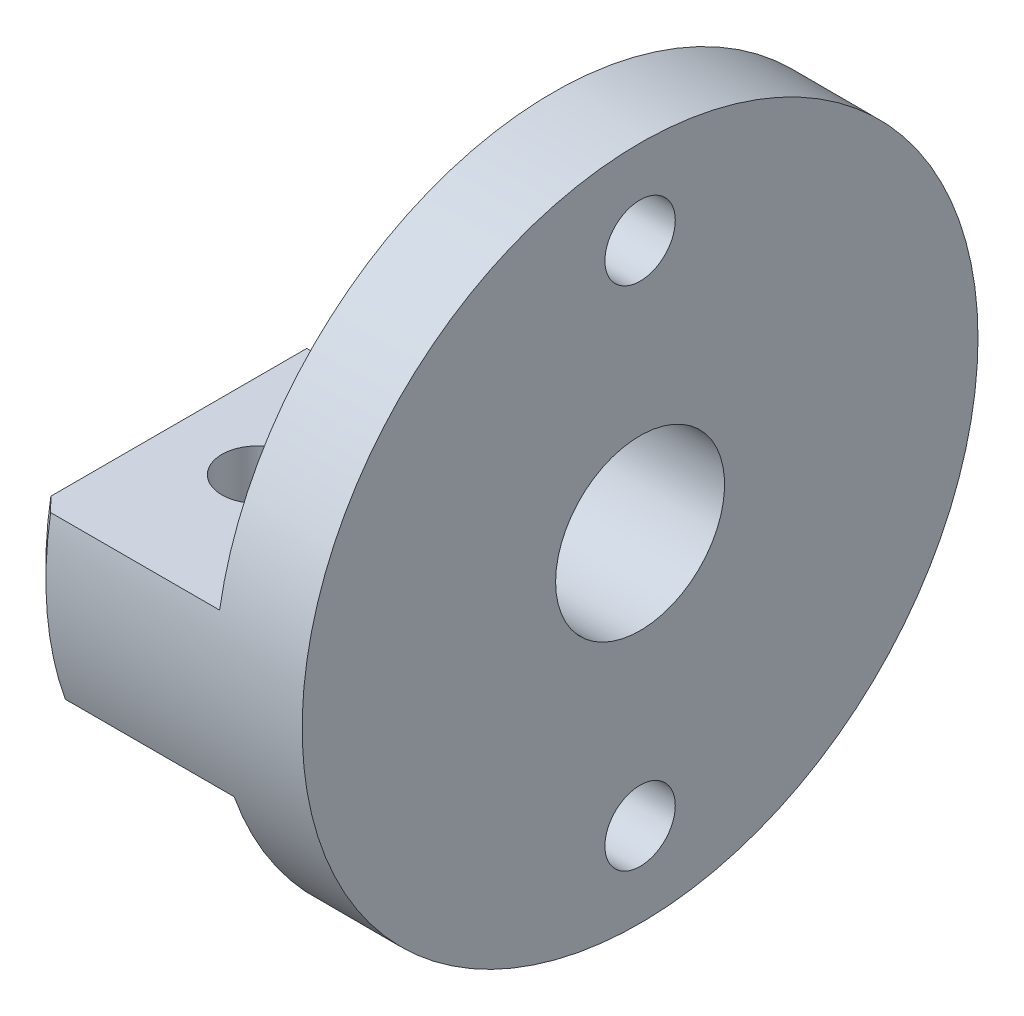
ISO-10303-21;
HEADER;
FILE_DESCRIPTION(('STEP AP214'),'2;1');
FILE_NAME('part.step','',(''),(''),'','','');
FILE_SCHEMA(('AUTOMOTIVE_DESIGN { 1 0 10303 214 1 1 1 1 }'));
ENDSEC;
DATA;
#1=APPLICATION_CONTEXT('core data for automotive mechanical design processes');
#2=APPLICATION_PROTOCOL_DEFINITION('international standard','automotive_design',2000,#1);
#3=PRODUCT_CONTEXT('',#1,'mechanical');
#4=PRODUCT('Part','Part','',(#3));
#5=PRODUCT_RELATED_PRODUCT_CATEGORY('part','',(#4));
#6=PRODUCT_DEFINITION_FORMATION('','',#4);
#7=PRODUCT_DEFINITION_CONTEXT('part definition',#1,'design');
#8=PRODUCT_DEFINITION('design','',#6,#7);
#9=PRODUCT_DEFINITION_SHAPE('','',#8);
#10=(LENGTH_UNIT() NAMED_UNIT(*) SI_UNIT(.MILLI.,.METRE.));
#11=(NAMED_UNIT(*) PLANE_ANGLE_UNIT() SI_UNIT($,.RADIAN.));
#12=(NAMED_UNIT(*) SI_UNIT($,.STERADIAN.) SOLID_ANGLE_UNIT());
#13=UNCERTAINTY_MEASURE_WITH_UNIT(LENGTH_MEASURE(1.E-05),#10,'distance_accuracy_value','');
#14=(GEOMETRIC_REPRESENTATION_CONTEXT(3) GLOBAL_UNCERTAINTY_ASSIGNED_CONTEXT((#13)) GLOBAL_UNIT_ASSIGNED_CONTEXT((#10,
#11,#12)) REPRESENTATION_CONTEXT('',''));
#15=CARTESIAN_POINT('',(0.,0.,0.));
#16=DIRECTION('',(0.,0.,1.));
#17=DIRECTION('',(1.,0.,0.));
#18=AXIS2_PLACEMENT_3D('',#15,#16,#17);
#19=CARTESIAN_POINT('',(6.,0.,0.));
#20=DIRECTION('',(-1.,0.,0.));
#21=DIRECTION('',(0.,0.,1.));
#22=AXIS2_PLACEMENT_3D('',#19,#20,#21);
#23=CYLINDRICAL_SURFACE('',#22,12.);
#24=CARTESIAN_POINT('',(6.5,0.,0.));
#25=DIRECTION('',(-1.,0.,0.));
#26=DIRECTION('',(0.,0.,1.));
#27=AXIS2_PLACEMENT_3D('',#24,#25,#26);
#28=CIRCLE('',#27,12.);
#29=CARTESIAN_POINT('',(6.5,-4.,-11.3137084989848));
#30=VERTEX_POINT('',#29);
#31=CARTESIAN_POINT('',(6.5,-4.,11.3137084989848));
#32=VERTEX_POINT('',#31);
#33=EDGE_CURVE('E121',#30,#32,#28,.T.);
#34=ORIENTED_EDGE('',*,*,#33,.F.);
#35=DIRECTION('',(-1.,0.,0.));
#36=VECTOR('',#35,1.);
#37=CARTESIAN_POINT('',(6.,-4.,-11.3137084989848));
#38=LINE('',#37,#36);
#39=CARTESIAN_POINT('',(0.499999999999997,-4.,-11.3137084989848));
#40=VERTEX_POINT('',#39);
#41=EDGE_CURVE('E126',#30,#40,#38,.T.);
#42=ORIENTED_EDGE('',*,*,#41,.T.);
#43=CARTESIAN_POINT('',(0.499999999999997,0.,0.));
#44=DIRECTION('',(1.,0.,0.));
#45=DIRECTION('',(0.,0.,-1.));
#46=AXIS2_PLACEMENT_3D('',#43,#44,#45);
#47=CIRCLE('',#46,12.);
#48=CARTESIAN_POINT('',(0.499999999999997,2.,-11.8321595661992));
#49=VERTEX_POINT('',#48);
#50=EDGE_CURVE('E188',#40,#49,#47,.T.);
#51=ORIENTED_EDGE('',*,*,#50,.T.);
#52=DIRECTION('',(-1.,0.,0.));
#53=VECTOR('',#52,1.);
#54=CARTESIAN_POINT('',(6.,2.,-11.8321595661992));
#55=LINE('',#54,#53);
#56=CARTESIAN_POINT('',(6.5,2.,-11.8321595661992));
#57=VERTEX_POINT('',#56);
#58=EDGE_CURVE('E165',#57,#49,#55,.T.);
#59=ORIENTED_EDGE('',*,*,#58,.F.);
#60=CARTESIAN_POINT('',(6.5,0.,0.));
#61=DIRECTION('',(-1.,0.,0.));
#62=DIRECTION('',(0.,0.,1.));
#63=AXIS2_PLACEMENT_3D('',#60,#61,#62);
#64=CIRCLE('',#63,12.);
#65=CARTESIAN_POINT('',(6.5,2.,11.8321595661992));
#66=VERTEX_POINT('',#65);
#67=EDGE_CURVE('E150',#66,#57,#64,.T.);
#68=ORIENTED_EDGE('',*,*,#67,.F.);
#69=DIRECTION('',(-1.,0.,0.));
#70=VECTOR('',#69,1.);
#71=CARTESIAN_POINT('',(6.,2.,11.8321595661992));
#72=LINE('',#71,#70);
#73=CARTESIAN_POINT('',(0.500000000000007,2.,11.8321595661992));
#74=VERTEX_POINT('',#73);
#75=EDGE_CURVE('E167',#66,#74,#72,.T.);
#76=ORIENTED_EDGE('',*,*,#75,.T.);
#77=CARTESIAN_POINT('',(0.500000000000007,0.,0.));
#78=DIRECTION('',(1.,0.,0.));
#79=DIRECTION('',(0.,0.,-1.));
#80=AXIS2_PLACEMENT_3D('',#77,#78,#79);
#81=CIRCLE('',#80,12.);
#82=CARTESIAN_POINT('',(0.500000000000007,-4.,11.3137084989848));
#83=VERTEX_POINT('',#82);
#84=EDGE_CURVE('E124',#74,#83,#81,.T.);
#85=ORIENTED_EDGE('',*,*,#84,.T.);
#86=DIRECTION('',(-1.,0.,0.));
#87=VECTOR('',#86,1.);
#88=CARTESIAN_POINT('',(6.,-4.,11.3137084989848));
#89=LINE('',#88,#87);
#90=EDGE_CURVE('E117',#32,#83,#89,.T.);
#91=ORIENTED_EDGE('',*,*,#90,.F.);
#92=EDGE_LOOP('',(#34,#42,#51,#59,#68,#76,#85,#91));
#93=FACE_BOUND('',#92,.T.);
#94=CARTESIAN_POINT('',(9.6,0.,0.));
#95=DIRECTION('',(1.,0.,0.));
#96=DIRECTION('',(0.,0.,-1.));
#97=AXIS2_PLACEMENT_3D('',#94,#95,#96);
#98=CIRCLE('',#97,12.);
#99=CARTESIAN_POINT('',(9.6,0.,-12.));
#100=VERTEX_POINT('',#99);
#101=EDGE_CURVE('E177',#100,#100,#98,.T.);
#102=ORIENTED_EDGE('',*,*,#101,.F.);
#103=EDGE_LOOP('',(#102));
#104=FACE_BOUND('',#103,.T.);
#105=ADVANCED_FACE('F49',(#93,#104),#23,.T.);
#106=CARTESIAN_POINT('',(0.,0.,0.));
#107=DIRECTION('',(1.,0.,0.));
#108=DIRECTION('',(0.,0.,-1.));
#109=AXIS2_PLACEMENT_3D('',#106,#107,#108);
#110=PLANE('',#109);
#111=DIRECTION('',(0.,0.,1.));
#112=VECTOR('',#111,1.);
#113=CARTESIAN_POINT('',(0.,2.,-11.8321595661992));
#114=LINE('',#113,#112);
#115=CARTESIAN_POINT('',(0.,2.,-11.3247516529061));
#116=VERTEX_POINT('',#115);
#117=CARTESIAN_POINT('',(0.,2.,-2.23606797749979));
#118=VERTEX_POINT('',#117);
#119=EDGE_CURVE('E163',#116,#118,#114,.T.);
#120=ORIENTED_EDGE('',*,*,#119,.F.);
#121=CARTESIAN_POINT('',(0.,0.,0.));
#122=DIRECTION('',(1.,0.,0.));
#123=DIRECTION('',(0.,0.,-1.));
#124=AXIS2_PLACEMENT_3D('',#121,#122,#123);
#125=CIRCLE('',#124,11.5);
#126=CARTESIAN_POINT('',(0.,-4.,-10.7819293264239));
#127=VERTEX_POINT('',#126);
#128=EDGE_CURVE('E67',#116,#127,#125,.F.);
#129=ORIENTED_EDGE('',*,*,#128,.T.);
#130=DIRECTION('',(0.,0.,-1.));
#131=VECTOR('',#130,1.);
#132=CARTESIAN_POINT('',(0.,-4.,11.3137084989848));
#133=LINE('',#132,#131);
#134=CARTESIAN_POINT('',(0.,-4.,10.7819293264239));
#135=VERTEX_POINT('',#134);
#136=EDGE_CURVE('E127',#135,#127,#133,.T.);
#137=ORIENTED_EDGE('',*,*,#136,.F.);
#138=CARTESIAN_POINT('',(0.,0.,0.));
#139=DIRECTION('',(1.,0.,0.));
#140=DIRECTION('',(0.,0.,-1.));
#141=AXIS2_PLACEMENT_3D('',#138,#139,#140);
#142=CIRCLE('',#141,11.5);
#143=CARTESIAN_POINT('',(0.,2.,11.3247516529061));
#144=VERTEX_POINT('',#143);
#145=EDGE_CURVE('E198',#135,#144,#142,.F.);
#146=ORIENTED_EDGE('',*,*,#145,.T.);
#147=CARTESIAN_POINT('',(0.,2.,2.23606797749979));
#148=VERTEX_POINT('',#147);
#149=EDGE_CURVE('E166',#148,#144,#114,.T.);
#150=ORIENTED_EDGE('',*,*,#149,.F.);
#151=CARTESIAN_POINT('',(0.,0.,0.));
#152=DIRECTION('',(-1.,0.,0.));
#153=DIRECTION('',(0.,0.,1.));
#154=AXIS2_PLACEMENT_3D('',#151,#152,#153);
#155=CIRCLE('',#154,3.);
#156=EDGE_CURVE('E169',#118,#148,#155,.T.);
#157=ORIENTED_EDGE('',*,*,#156,.F.);
#158=EDGE_LOOP('',(#120,#129,#137,#146,#150,#157));
#159=FACE_BOUND('',#158,.T.);
#160=ADVANCED_FACE('F273',(#159),#110,.F.);
#161=CARTESIAN_POINT('',(9.6,0.,0.));
#162=DIRECTION('',(1.,0.,0.));
#163=DIRECTION('',(0.,0.,-1.));
#164=AXIS2_PLACEMENT_3D('',#161,#162,#163);
#165=PLANE('',#164);
#166=CARTESIAN_POINT('',(9.6,9.,0.));
#167=DIRECTION('',(1.,0.,0.));
#168=DIRECTION('',(0.,0.,-1.));
#169=AXIS2_PLACEMENT_3D('',#166,#167,#168);
#170=CIRCLE('',#169,1.25);
#171=CARTESIAN_POINT('',(9.6,9.,-1.25));
#172=VERTEX_POINT('',#171);
#173=EDGE_CURVE('E228',#172,#172,#170,.T.);
#174=ORIENTED_EDGE('',*,*,#173,.F.);
#175=EDGE_LOOP('',(#174));
#176=FACE_BOUND('',#175,.T.);
#177=CARTESIAN_POINT('',(9.6,-9.,0.));
#178=DIRECTION('',(1.,0.,0.));
#179=DIRECTION('',(0.,0.,-1.));
#180=AXIS2_PLACEMENT_3D('',#177,#178,#179);
#181=CIRCLE('',#180,1.25);
#182=CARTESIAN_POINT('',(9.6,-9.,-1.25));
#183=VERTEX_POINT('',#182);
#184=EDGE_CURVE('E234',#183,#183,#181,.T.);
#185=ORIENTED_EDGE('',*,*,#184,.F.);
#186=EDGE_LOOP('',(#185));
#187=FACE_BOUND('',#186,.T.);
#188=CARTESIAN_POINT('',(9.6,0.,0.));
#189=DIRECTION('',(-1.,0.,0.));
#190=DIRECTION('',(0.,0.,1.));
#191=AXIS2_PLACEMENT_3D('',#188,#189,#190);
#192=CIRCLE('',#191,3.);
#193=CARTESIAN_POINT('',(9.6,0.,3.));
#194=VERTEX_POINT('',#193);
#195=EDGE_CURVE('E174',#194,#194,#192,.T.);
#196=ORIENTED_EDGE('',*,*,#195,.T.);
#197=EDGE_LOOP('',(#196));
#198=FACE_BOUND('',#197,.T.);
#199=ORIENTED_EDGE('',*,*,#101,.T.);
#200=EDGE_LOOP('',(#199));
#201=FACE_BOUND('',#200,.T.);
#202=ADVANCED_FACE('F278',(#176,#187,#198,#201),#165,.T.);
#203=CARTESIAN_POINT('',(9.6,0.,0.));
#204=DIRECTION('',(-1.,0.,0.));
#205=DIRECTION('',(0.,0.,1.));
#206=AXIS2_PLACEMENT_3D('',#203,#204,#205);
#207=CYLINDRICAL_SURFACE('',#206,3.);
#208=CARTESIAN_POINT('',(2.6,-2.72717802865893,-1.25));
#209=CARTESIAN_POINT('',(2.66667189089685,-2.72718519563219,-1.24999259066568));
#210=CARTESIAN_POINT('',(2.73345265682622,-2.729658595344,-1.24463203881503));
#211=CARTESIAN_POINT('',(2.86508694205714,-2.73923833650884,-1.22339678947785));
#212=CARTESIAN_POINT('',(2.92993472667524,-2.74635725824267,-1.20749354003276));
#213=CARTESIAN_POINT('',(3.05556112969107,-2.76426917574768,-1.16589988419451));
#214=CARTESIAN_POINT('',(3.11635516371502,-2.77504717562616,-1.14024937431428));
#215=CARTESIAN_POINT('',(3.23275944957805,-2.79904148565793,-1.08000637754463));
#216=CARTESIAN_POINT('',(3.28837092343312,-2.81225721880783,-1.04541600591531));
#217=CARTESIAN_POINT('',(3.39632572497347,-2.84055762619857,-0.965973882676167));
#218=CARTESIAN_POINT('',(3.44830755874409,-2.85570568079146,-0.920653238184409));
#219=CARTESIAN_POINT('',(3.54420022249756,-2.88564295372227,-0.82202167574555));
#220=CARTESIAN_POINT('',(3.58810794061301,-2.90043203180789,-0.768707691374005));
#221=CARTESIAN_POINT('',(3.66844953087928,-2.92875537930613,-0.652763393797348));
#222=CARTESIAN_POINT('',(3.70447662803235,-2.94220739975291,-0.589829293683659));
#223=CARTESIAN_POINT('',(3.76527602050561,-2.96556519993426,-0.458132022362353));
#224=CARTESIAN_POINT('',(3.79005331196422,-2.97547255347157,-0.389371454872124));
#225=CARTESIAN_POINT('',(3.82633945875674,-2.99017521042367,-0.251768498025165));
#226=CARTESIAN_POINT('',(3.83847169490205,-2.99520971127466,-0.18311657619608));
#227=CARTESIAN_POINT('',(3.85113764115986,-3.00046828611204,-0.044579180365006));
#228=CARTESIAN_POINT('',(3.85167605588296,-3.00069431131015,0.0253057817645165));
#229=CARTESIAN_POINT('',(3.84146571906668,-2.99645129133057,0.159792780112568));
#230=CARTESIAN_POINT('',(3.83140189947427,-2.99226714648664,0.224457488607314));
#231=CARTESIAN_POINT('',(3.80144689736184,-2.98006516750309,0.351082893931456));
#232=CARTESIAN_POINT('',(3.78155499036984,-2.97204705074577,0.413043391054916));
#233=CARTESIAN_POINT('',(3.73227195910536,-2.95279852414029,0.533638118077526));
#234=CARTESIAN_POINT('',(3.70274053712918,-2.94152097126085,0.592207177074906));
#235=CARTESIAN_POINT('',(3.63515424329966,-2.91685713989805,0.703711767281963));
#236=CARTESIAN_POINT('',(3.59709635915501,-2.90347011666255,0.756645297756975));
#237=CARTESIAN_POINT('',(3.51041757959538,-2.87481698777061,0.859340911707924));
#238=CARTESIAN_POINT('',(3.46124120872099,-2.8594849435601,0.908616437316241));
#239=CARTESIAN_POINT('',(3.35528855929342,-2.8293786068147,0.998431414927668));
#240=CARTESIAN_POINT('',(3.29850936170791,-2.8146045313137,1.03896749582431));
#241=CARTESIAN_POINT('',(3.17660496333809,-2.78681612355338,1.11140189250063));
#242=CARTESIAN_POINT('',(3.11126679425672,-2.77387558556714,1.1429725335554));
#243=CARTESIAN_POINT('',(2.9755189550255,-2.75209844221011,1.19446432058392));
#244=CARTESIAN_POINT('',(2.90511295173045,-2.74325890334594,1.21439379627313));
#245=CARTESIAN_POINT('',(2.766103191086,-2.73141212519724,1.24080025168121));
#246=CARTESIAN_POINT('',(2.69767887774095,-2.72806369197117,1.24806614632866));
#247=CARTESIAN_POINT('',(2.5605215175885,-2.72660286810642,1.25125630518999));
#248=CARTESIAN_POINT('',(2.49178858580829,-2.72848866599319,1.24718449318149));
#249=CARTESIAN_POINT('',(2.36060161456955,-2.73693131345749,1.22853477565556));
#250=CARTESIAN_POINT('',(2.2980273132132,-2.74318138016618,1.21464618818048));
#251=CARTESIAN_POINT('',(2.17614870350213,-2.75925630297447,1.17767058564225));
#252=CARTESIAN_POINT('',(2.11684516316929,-2.76908199460161,1.15458142053125));
#253=CARTESIAN_POINT('',(2.00038468964353,-2.79170797857,1.09877520805187));
#254=CARTESIAN_POINT('',(1.94342502538968,-2.80461662202282,1.06569183306198));
#255=CARTESIAN_POINT('',(1.83559194750098,-2.83180003740794,0.991200784385971));
#256=CARTESIAN_POINT('',(1.78472118329813,-2.84607539920583,0.949789507875988));
#257=CARTESIAN_POINT('',(1.68619986511599,-2.87578619784532,0.855844455715506));
#258=CARTESIAN_POINT('',(1.63914860004934,-2.89122146708842,0.802679661479739));
#259=CARTESIAN_POINT('',(1.55452770802067,-2.92043361183923,0.68885151255354));
#260=CARTESIAN_POINT('',(1.5169587759363,-2.93421036577013,0.628187608803657));
#261=CARTESIAN_POINT('',(1.45241012455642,-2.9586425158565,0.500654680803385));
#262=CARTESIAN_POINT('',(1.42545775871052,-2.96928983138826,0.433770169638507));
#263=CARTESIAN_POINT('',(1.38338320766557,-2.98618173103366,0.295858835154417));
#264=CARTESIAN_POINT('',(1.36825398177393,-2.9924289351992,0.224834504225196));
#265=CARTESIAN_POINT('',(1.35114187447969,-2.9995153479751,0.0860165335064118));
#266=CARTESIAN_POINT('',(1.34831400030304,-3.00070204534225,0.0183440847938984));
#267=CARTESIAN_POINT('',(1.35361314129394,-2.99849523480953,-0.116486811714285));
#268=CARTESIAN_POINT('',(1.36173823601287,-2.99510252984313,-0.183645347541155));
#269=CARTESIAN_POINT('',(1.38810607215866,-2.98430065981734,-0.313086482449184));
#270=CARTESIAN_POINT('',(1.40597968046955,-2.97703824209233,-0.375457537843568));
#271=CARTESIAN_POINT('',(1.45093424720913,-2.95929499847058,-0.49629223050133));
#272=CARTESIAN_POINT('',(1.4780169546649,-2.94881356124207,-0.554755122985826));
#273=CARTESIAN_POINT('',(1.54198952921446,-2.92505825398662,-0.669024565478781));
#274=CARTESIAN_POINT('',(1.57926730142399,-2.91167959188766,-0.724591657976682));
#275=CARTESIAN_POINT('',(1.66200718287189,-2.88371561874231,-0.828918675638781));
#276=CARTESIAN_POINT('',(1.70747233040675,-2.86912986083797,-0.877676061786042));
#277=CARTESIAN_POINT('',(1.8089448258544,-2.83914845259141,-0.97044978723158));
#278=CARTESIAN_POINT('',(1.86545901462112,-2.82376522857896,-1.01391775364847));
#279=CARTESIAN_POINT('',(1.98545874068019,-2.79495552690186,-1.09083332306674));
#280=CARTESIAN_POINT('',(2.04894814805814,-2.78153014522558,-1.12427532456755));
#281=CARTESIAN_POINT('',(2.18094383502275,-2.75842557732642,-1.17982766043577));
#282=CARTESIAN_POINT('',(2.24942115879321,-2.74872654469865,-1.20199823632854));
#283=CARTESIAN_POINT('',(2.38953957385067,-2.73440803066667,-1.23423556453801));
#284=CARTESIAN_POINT('',(2.4611692072743,-2.72977151604981,-1.2443429152121));
#285=CARTESIAN_POINT('',(2.55535852426189,-2.72744979732688,-1.2494046492365));
#286=CARTESIAN_POINT('',(2.57767315738803,-2.72717562860874,-1.25000248121118));
#287=CARTESIAN_POINT('',(2.6,-2.72717802865893,-1.25));
#288=B_SPLINE_CURVE_WITH_KNOTS('',3,(#208,#209,#210,#211,#212,#213,#214,#215,#216,#217,#218,
#219,#220,#221,#222,#223,#224,#225,#226,#227,#228,#229,#230,#231,#232,#233,#234,#235,#236,#237,
#238,#239,#240,#241,#242,#243,#244,#245,#246,#247,#248,#249,#250,#251,#252,#253,#254,#255,#256,
#257,#258,#259,#260,#261,#262,#263,#264,#265,#266,#267,#268,#269,#270,#271,#272,#273,#274,#275,
#276,#277,#278,#279,#280,#281,#282,#283,#284,#285,#286,#287),.UNSPECIFIED.,.T.,.F.,(4,2,2,2,2,2,
2,2,2,2,2,2,2,2,2,2,2,2,2,2,2,2,2,2,2,2,2,2,2,2,2,2,2,2,2,2,2,2,2,4),(0.,0.199951711985515,
0.400447161842176,0.600130652152111,0.7997669385501,1.01066841430654,1.22165100459911,
1.44178476577924,1.66182066774891,1.87040605977952,2.0789068091793,2.27471840245093,
2.47054443201884,2.66935814640066,2.86824221022484,3.08114531844484,3.29413040441367,
3.51411545666722,3.73394290745569,3.93950778306308,4.14500152518449,4.33733901066192,
4.5297214691353,4.73025126818169,4.93086800795466,5.14781662735514,5.36478114041867,
5.58230105955595,5.79969134643008,6.00188635094054,6.20404590801915,6.39903415036488,
6.59405944632173,6.79789862829037,7.00181361048905,7.21960426908078,7.4375163813919,
7.65425125796866,7.87025464546163,7.93721375436707),.UNSPECIFIED.);
#289=CARTESIAN_POINT('',(2.6,-2.72717802865893,-1.25));
#290=VERTEX_POINT('',#289);
#291=EDGE_CURVE('E147',#290,#290,#288,.T.);
#292=ORIENTED_EDGE('',*,*,#291,.T.);
#293=EDGE_LOOP('',(#292));
#294=FACE_BOUND('',#293,.T.);
#295=CARTESIAN_POINT('',(6.5,0.,0.));
#296=DIRECTION('',(1.,0.,0.));
#297=DIRECTION('',(0.,0.,1.));
#298=AXIS2_PLACEMENT_3D('',#295,#296,#297);
#299=CIRCLE('',#298,3.);
#300=CARTESIAN_POINT('',(6.5,2.,-2.23606797749979));
#301=VERTEX_POINT('',#300);
#302=CARTESIAN_POINT('',(6.5,2.,2.23606797749979));
#303=VERTEX_POINT('',#302);
#304=EDGE_CURVE('E143',#301,#303,#299,.T.);
#305=ORIENTED_EDGE('',*,*,#304,.F.);
#306=DIRECTION('',(-1.,0.,0.));
#307=VECTOR('',#306,1.);
#308=CARTESIAN_POINT('',(9.6,2.,-2.23606797749979));
#309=LINE('',#308,#307);
#310=EDGE_CURVE('E182',#301,#118,#309,.T.);
#311=ORIENTED_EDGE('',*,*,#310,.T.);
#312=ORIENTED_EDGE('',*,*,#156,.T.);
#313=DIRECTION('',(-1.,0.,0.));
#314=VECTOR('',#313,1.);
#315=CARTESIAN_POINT('',(9.6,2.,2.23606797749979));
#316=LINE('',#315,#314);
#317=EDGE_CURVE('E185',#148,#303,#316,.F.);
#318=ORIENTED_EDGE('',*,*,#317,.T.);
#319=EDGE_LOOP('',(#305,#311,#312,#318));
#320=FACE_BOUND('',#319,.T.);
#321=ORIENTED_EDGE('',*,*,#195,.F.);
#322=EDGE_LOOP('',(#321));
#323=FACE_BOUND('',#322,.T.);
#324=ADVANCED_FACE('F209',(#294,#320,#323),#207,.F.);
#325=CARTESIAN_POINT('',(6.,2.,-11.8321595661992));
#326=DIRECTION('',(0.,-1.,0.));
#327=DIRECTION('',(0.,0.,-1.));
#328=AXIS2_PLACEMENT_3D('',#325,#326,#327);
#329=PLANE('',#328);
#330=CARTESIAN_POINT('',(3.,2.,7.));
#331=DIRECTION('',(0.,-1.,0.));
#332=DIRECTION('',(0.,0.,-1.));
#333=AXIS2_PLACEMENT_3D('',#330,#331,#332);
#334=CIRCLE('',#333,1.25);
#335=CARTESIAN_POINT('',(3.,2.,5.75));
#336=VERTEX_POINT('',#335);
#337=EDGE_CURVE('E156',#336,#336,#334,.T.);
#338=ORIENTED_EDGE('',*,*,#337,.T.);
#339=EDGE_LOOP('',(#338));
#340=FACE_BOUND('',#339,.T.);
#341=ORIENTED_EDGE('',*,*,#149,.T.);
#342=CARTESIAN_POINT('',(0.,2.,11.3247516529061));
#343=CARTESIAN_POINT('',(0.0833064804018677,2.,11.4093460994359));
#344=CARTESIAN_POINT('',(0.166626387291822,2.,11.4939273154978));
#345=CARTESIAN_POINT('',(0.33329305395852,2.,11.6630632865955));
#346=CARTESIAN_POINT('',(0.416639813735235,2.,11.7476180416312));
#347=CARTESIAN_POINT('',(0.500000000000007,2.,11.8321595661992));
#348=B_SPLINE_CURVE_WITH_KNOTS('',3,(#342,#343,#344,#345,#346,#347),.UNSPECIFIED.,.F.,.F.,(4,2,
4),(0.,0.356182117675835,0.712364234969621),.UNSPECIFIED.);
#349=EDGE_CURVE('E11',#144,#74,#348,.T.);
#350=ORIENTED_EDGE('',*,*,#349,.T.);
#351=ORIENTED_EDGE('',*,*,#75,.F.);
#352=DIRECTION('',(0.,0.,1.));
#353=VECTOR('',#352,1.);
#354=CARTESIAN_POINT('',(6.5,2.,2.23606797749979));
#355=LINE('',#354,#353);
#356=EDGE_CURVE('E146',#303,#66,#355,.T.);
#357=ORIENTED_EDGE('',*,*,#356,.F.);
#358=ORIENTED_EDGE('',*,*,#317,.F.);
#359=EDGE_LOOP('',(#341,#350,#351,#357,#358));
#360=FACE_BOUND('',#359,.T.);
#361=ADVANCED_FACE('F203',(#340,#360),#329,.F.);
#362=CARTESIAN_POINT('',(3.,2.,-7.));
#363=DIRECTION('',(0.,-1.,0.));
#364=DIRECTION('',(0.,0.,-1.));
#365=AXIS2_PLACEMENT_3D('',#362,#363,#364);
#366=CIRCLE('',#365,1.25);
#367=CARTESIAN_POINT('',(3.,2.,-8.25));
#368=VERTEX_POINT('',#367);
#369=EDGE_CURVE('E160',#368,#368,#366,.T.);
#370=ORIENTED_EDGE('',*,*,#369,.T.);
#371=EDGE_LOOP('',(#370));
#372=FACE_BOUND('',#371,.T.);
#373=ORIENTED_EDGE('',*,*,#58,.T.);
#374=CARTESIAN_POINT('',(0.499999999999997,2.,-11.8321595661992));
#375=CARTESIAN_POINT('',(0.416639813735226,2.,-11.7476180416312));
#376=CARTESIAN_POINT('',(0.333293053958513,2.,-11.6630632865955));
#377=CARTESIAN_POINT('',(0.166626387291819,2.,-11.4939273154978));
#378=CARTESIAN_POINT('',(0.0833064804018657,2.,-11.4093460994359));
#379=CARTESIAN_POINT('',(0.,2.,-11.3247516529061));
#380=B_SPLINE_CURVE_WITH_KNOTS('',3,(#374,#375,#376,#377,#378,#379),.UNSPECIFIED.,.F.,.F.,(4,2,
4),(0.,0.356182117293778,0.712364234969606),.UNSPECIFIED.);
#381=EDGE_CURVE('E191',#49,#116,#380,.T.);
#382=ORIENTED_EDGE('',*,*,#381,.T.);
#383=ORIENTED_EDGE('',*,*,#119,.T.);
#384=ORIENTED_EDGE('',*,*,#310,.F.);
#385=DIRECTION('',(0.,0.,1.));
#386=VECTOR('',#385,1.);
#387=CARTESIAN_POINT('',(6.5,2.,-11.8321595661992));
#388=LINE('',#387,#386);
#389=EDGE_CURVE('E133',#57,#301,#388,.T.);
#390=ORIENTED_EDGE('',*,*,#389,.F.);
#391=EDGE_LOOP('',(#373,#382,#383,#384,#390));
#392=FACE_BOUND('',#391,.T.);
#393=ADVANCED_FACE('F208',(#372,#392),#329,.F.);
#394=CARTESIAN_POINT('',(6.,-4.,11.3137084989848));
#395=DIRECTION('',(0.,1.,0.));
#396=DIRECTION('',(0.,0.,1.));
#397=AXIS2_PLACEMENT_3D('',#394,#395,#396);
#398=PLANE('',#397);
#399=CARTESIAN_POINT('',(2.6,-4.,0.));
#400=DIRECTION('',(0.,-1.,0.));
#401=DIRECTION('',(0.,0.,-1.));
#402=AXIS2_PLACEMENT_3D('',#399,#400,#401);
#403=CIRCLE('',#402,1.25);
#404=CARTESIAN_POINT('',(2.6,-4.,-1.25));
#405=VERTEX_POINT('',#404);
#406=EDGE_CURVE('E232',#405,#405,#403,.T.);
#407=ORIENTED_EDGE('',*,*,#406,.F.);
#408=EDGE_LOOP('',(#407));
#409=FACE_BOUND('',#408,.T.);
#410=CARTESIAN_POINT('',(3.,-4.,-7.));
#411=DIRECTION('',(0.,-1.,0.));
#412=DIRECTION('',(0.,0.,-1.));
#413=AXIS2_PLACEMENT_3D('',#410,#411,#412);
#414=CIRCLE('',#413,1.25);
#415=CARTESIAN_POINT('',(3.,-4.,-8.25));
#416=VERTEX_POINT('',#415);
#417=EDGE_CURVE('E139',#416,#416,#414,.T.);
#418=ORIENTED_EDGE('',*,*,#417,.F.);
#419=EDGE_LOOP('',(#418));
#420=FACE_BOUND('',#419,.T.);
#421=CARTESIAN_POINT('',(3.,-4.,7.));
#422=DIRECTION('',(0.,-1.,0.));
#423=DIRECTION('',(0.,0.,1.));
#424=AXIS2_PLACEMENT_3D('',#421,#422,#423);
#425=CIRCLE('',#424,1.25);
#426=CARTESIAN_POINT('',(3.,-4.,8.25));
#427=VERTEX_POINT('',#426);
#428=EDGE_CURVE('E136',#427,#427,#425,.T.);
#429=ORIENTED_EDGE('',*,*,#428,.F.);
#430=EDGE_LOOP('',(#429));
#431=FACE_BOUND('',#430,.T.);
#432=ORIENTED_EDGE('',*,*,#136,.T.);
#433=CARTESIAN_POINT('',(0.,-4.,-10.7819293264239));
#434=CARTESIAN_POINT('',(0.0832099049809617,-4.,-10.8706752425027));
#435=CARTESIAN_POINT('',(0.166481524568598,-4.,-10.9593631320454));
#436=CARTESIAN_POINT('',(0.333148191237811,-4.,-11.1366228562299));
#437=CARTESIAN_POINT('',(0.41654323831684,-4.,-11.2251946908742));
#438=CARTESIAN_POINT('',(0.499999999999997,-4.,-11.3137084989848));
#439=B_SPLINE_CURVE_WITH_KNOTS('',3,(#433,#434,#435,#436,#437,#438),.UNSPECIFIED.,.F.,.F.,(4,2,
4),(0.,0.36496210683106,0.729924206131887),.UNSPECIFIED.);
#440=EDGE_CURVE('E59',#127,#40,#439,.T.);
#441=ORIENTED_EDGE('',*,*,#440,.T.);
#442=ORIENTED_EDGE('',*,*,#41,.F.);
#443=DIRECTION('',(0.,0.,-1.));
#444=VECTOR('',#443,1.);
#445=CARTESIAN_POINT('',(6.5,-4.,11.3137084989848));
#446=LINE('',#445,#444);
#447=EDGE_CURVE('E132',#32,#30,#446,.T.);
#448=ORIENTED_EDGE('',*,*,#447,.F.);
#449=ORIENTED_EDGE('',*,*,#90,.T.);
#450=CARTESIAN_POINT('',(0.500000000000007,-4.,11.3137084989848));
#451=CARTESIAN_POINT('',(0.416543238316848,-4.,11.2251946908742));
#452=CARTESIAN_POINT('',(0.333148191237817,-4.,11.1366228562299));
#453=CARTESIAN_POINT('',(0.166481524568602,-4.,10.9593631320454));
#454=CARTESIAN_POINT('',(0.0832099049809638,-4.,10.8706752425027));
#455=CARTESIAN_POINT('',(0.,-4.,10.7819293264239));
#456=B_SPLINE_CURVE_WITH_KNOTS('',3,(#450,#451,#452,#453,#454,#455),.UNSPECIFIED.,.F.,.F.,(4,2,
4),(0.,0.364962099300833,0.729924206131899),.UNSPECIFIED.);
#457=EDGE_CURVE('E74',#83,#135,#456,.T.);
#458=ORIENTED_EDGE('',*,*,#457,.T.);
#459=EDGE_LOOP('',(#432,#441,#442,#448,#449,#458));
#460=FACE_BOUND('',#459,.T.);
#461=ADVANCED_FACE('F135',(#409,#420,#431,#460),#398,.F.);
#462=CARTESIAN_POINT('',(0.499999999999997,0.,0.));
#463=DIRECTION('',(1.,0.,0.));
#464=DIRECTION('',(0.,0.,-1.));
#465=AXIS2_PLACEMENT_3D('',#462,#463,#464);
#466=CONICAL_SURFACE('',#465,12.,0.78539816339745);
#467=ORIENTED_EDGE('',*,*,#440,.F.);
#468=ORIENTED_EDGE('',*,*,#128,.F.);
#469=ORIENTED_EDGE('',*,*,#381,.F.);
#470=ORIENTED_EDGE('',*,*,#50,.F.);
#471=EDGE_LOOP('',(#467,#468,#469,#470));
#472=FACE_BOUND('',#471,.T.);
#473=ADVANCED_FACE('F200',(#472),#466,.T.);
#474=CARTESIAN_POINT('',(0.500000000000007,0.,0.));
#475=DIRECTION('',(1.,0.,0.));
#476=DIRECTION('',(0.,0.,-1.));
#477=AXIS2_PLACEMENT_3D('',#474,#475,#476);
#478=CONICAL_SURFACE('',#477,12.,0.78539816339745);
#479=ORIENTED_EDGE('',*,*,#349,.F.);
#480=ORIENTED_EDGE('',*,*,#145,.F.);
#481=ORIENTED_EDGE('',*,*,#457,.F.);
#482=ORIENTED_EDGE('',*,*,#84,.F.);
#483=EDGE_LOOP('',(#479,#480,#481,#482));
#484=FACE_BOUND('',#483,.T.);
#485=ADVANCED_FACE('F51',(#484),#478,.T.);
#486=CARTESIAN_POINT('',(3.,12.,7.));
#487=DIRECTION('',(0.,-1.,0.));
#488=DIRECTION('',(0.,0.,-1.));
#489=AXIS2_PLACEMENT_3D('',#486,#487,#488);
#490=CYLINDRICAL_SURFACE('',#489,1.25);
#491=ORIENTED_EDGE('',*,*,#428,.T.);
#492=EDGE_LOOP('',(#491));
#493=FACE_BOUND('',#492,.T.);
#494=ORIENTED_EDGE('',*,*,#337,.F.);
#495=EDGE_LOOP('',(#494));
#496=FACE_BOUND('',#495,.T.);
#497=ADVANCED_FACE('F211',(#493,#496),#490,.F.);
#498=CARTESIAN_POINT('',(3.,12.,-7.));
#499=DIRECTION('',(0.,-1.,0.));
#500=DIRECTION('',(0.,0.,-1.));
#501=AXIS2_PLACEMENT_3D('',#498,#499,#500);
#502=CYLINDRICAL_SURFACE('',#501,1.25);
#503=ORIENTED_EDGE('',*,*,#417,.T.);
#504=EDGE_LOOP('',(#503));
#505=FACE_BOUND('',#504,.T.);
#506=ORIENTED_EDGE('',*,*,#369,.F.);
#507=EDGE_LOOP('',(#506));
#508=FACE_BOUND('',#507,.T.);
#509=ADVANCED_FACE('F261',(#505,#508),#502,.F.);
#510=CARTESIAN_POINT('',(6.5,0.,0.));
#511=DIRECTION('',(-1.,0.,0.));
#512=DIRECTION('',(0.,0.,1.));
#513=AXIS2_PLACEMENT_3D('',#510,#511,#512);
#514=PLANE('',#513);
#515=CARTESIAN_POINT('',(6.5,-9.,0.));
#516=DIRECTION('',(-1.,0.,0.));
#517=DIRECTION('',(0.,0.,1.));
#518=AXIS2_PLACEMENT_3D('',#515,#516,#517);
#519=CIRCLE('',#518,1.25);
#520=CARTESIAN_POINT('',(6.5,-9.,1.25));
#521=VERTEX_POINT('',#520);
#522=EDGE_CURVE('E54',#521,#521,#519,.T.);
#523=ORIENTED_EDGE('',*,*,#522,.F.);
#524=EDGE_LOOP('',(#523));
#525=FACE_BOUND('',#524,.T.);
#526=ORIENTED_EDGE('',*,*,#33,.T.);
#527=ORIENTED_EDGE('',*,*,#447,.T.);
#528=EDGE_LOOP('',(#526,#527));
#529=FACE_BOUND('',#528,.T.);
#530=ADVANCED_FACE('F131',(#525,#529),#514,.T.);
#531=CARTESIAN_POINT('',(6.5,0.,0.));
#532=DIRECTION('',(-1.,0.,0.));
#533=DIRECTION('',(0.,0.,1.));
#534=AXIS2_PLACEMENT_3D('',#531,#532,#533);
#535=PLANE('',#534);
#536=CARTESIAN_POINT('',(6.5,9.,0.));
#537=DIRECTION('',(-1.,0.,0.));
#538=DIRECTION('',(0.,0.,1.));
#539=AXIS2_PLACEMENT_3D('',#536,#537,#538);
#540=CIRCLE('',#539,1.25);
#541=CARTESIAN_POINT('',(6.5,9.,1.25));
#542=VERTEX_POINT('',#541);
#543=EDGE_CURVE('E226',#542,#542,#540,.T.);
#544=ORIENTED_EDGE('',*,*,#543,.F.);
#545=EDGE_LOOP('',(#544));
#546=FACE_BOUND('',#545,.T.);
#547=ORIENTED_EDGE('',*,*,#304,.T.);
#548=ORIENTED_EDGE('',*,*,#356,.T.);
#549=ORIENTED_EDGE('',*,*,#67,.T.);
#550=ORIENTED_EDGE('',*,*,#389,.T.);
#551=EDGE_LOOP('',(#547,#548,#549,#550));
#552=FACE_BOUND('',#551,.T.);
#553=ADVANCED_FACE('F255',(#546,#552),#535,.T.);
#554=CARTESIAN_POINT('',(2.6,12.,0.));
#555=DIRECTION('',(0.,-1.,0.));
#556=DIRECTION('',(0.,0.,-1.));
#557=AXIS2_PLACEMENT_3D('',#554,#555,#556);
#558=CYLINDRICAL_SURFACE('',#557,1.25);
#559=ORIENTED_EDGE('',*,*,#406,.T.);
#560=EDGE_LOOP('',(#559));
#561=FACE_BOUND('',#560,.T.);
#562=ORIENTED_EDGE('',*,*,#291,.F.);
#563=EDGE_LOOP('',(#562));
#564=FACE_BOUND('',#563,.T.);
#565=ADVANCED_FACE('F249',(#561,#564),#558,.F.);
#566=CARTESIAN_POINT('',(0.,9.,0.));
#567=DIRECTION('',(1.,0.,0.));
#568=DIRECTION('',(0.,0.,-1.));
#569=AXIS2_PLACEMENT_3D('',#566,#567,#568);
#570=CYLINDRICAL_SURFACE('',#569,1.25);
#571=ORIENTED_EDGE('',*,*,#543,.T.);
#572=EDGE_LOOP('',(#571));
#573=FACE_BOUND('',#572,.T.);
#574=ORIENTED_EDGE('',*,*,#173,.T.);
#575=EDGE_LOOP('',(#574));
#576=FACE_BOUND('',#575,.T.);
#577=ADVANCED_FACE('F254',(#573,#576),#570,.F.);
#578=CARTESIAN_POINT('',(0.,-9.,0.));
#579=DIRECTION('',(1.,0.,0.));
#580=DIRECTION('',(0.,0.,-1.));
#581=AXIS2_PLACEMENT_3D('',#578,#579,#580);
#582=CYLINDRICAL_SURFACE('',#581,1.25);
#583=ORIENTED_EDGE('',*,*,#522,.T.);
#584=EDGE_LOOP('',(#583));
#585=FACE_BOUND('',#584,.T.);
#586=ORIENTED_EDGE('',*,*,#184,.T.);
#587=EDGE_LOOP('',(#586));
#588=FACE_BOUND('',#587,.T.);
#589=ADVANCED_FACE('F257',(#585,#588),#582,.F.);
#590=CLOSED_SHELL('',(#105,#160,#202,#324,#361,#393,#461,#473,#485,#497,#509,#530,#553,#565,
#577,#589));
#591=MANIFOLD_SOLID_BREP('B2',#590);
#592=ADVANCED_BREP_SHAPE_REPRESENTATION('',(#18,#591),#14);
#593=SHAPE_DEFINITION_REPRESENTATION(#9,#592);
ENDSEC;
END-ISO-10303-21;
